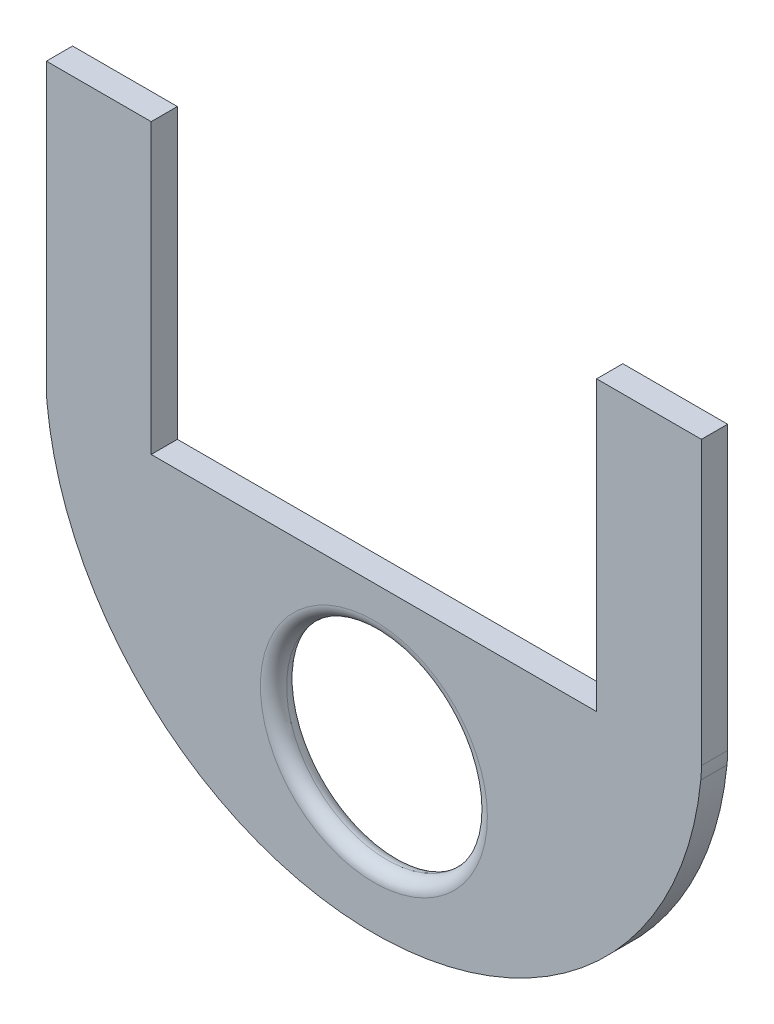
ISO-10303-21;
HEADER;
FILE_DESCRIPTION(('STEP AP214'),'2;1');
FILE_NAME('part.step','',(''),(''),'','','');
FILE_SCHEMA(('AUTOMOTIVE_DESIGN { 1 0 10303 214 1 1 1 1 }'));
ENDSEC;
DATA;
#1=APPLICATION_CONTEXT('core data for automotive mechanical design processes');
#2=APPLICATION_PROTOCOL_DEFINITION('international standard','automotive_design',2000,#1);
#3=PRODUCT_CONTEXT('',#1,'mechanical');
#4=PRODUCT('Part','Part','',(#3));
#5=PRODUCT_RELATED_PRODUCT_CATEGORY('part','',(#4));
#6=PRODUCT_DEFINITION_FORMATION('','',#4);
#7=PRODUCT_DEFINITION_CONTEXT('part definition',#1,'design');
#8=PRODUCT_DEFINITION('design','',#6,#7);
#9=PRODUCT_DEFINITION_SHAPE('','',#8);
#10=(LENGTH_UNIT() NAMED_UNIT(*) SI_UNIT(.MILLI.,.METRE.));
#11=(NAMED_UNIT(*) PLANE_ANGLE_UNIT() SI_UNIT($,.RADIAN.));
#12=(NAMED_UNIT(*) SI_UNIT($,.STERADIAN.) SOLID_ANGLE_UNIT());
#13=UNCERTAINTY_MEASURE_WITH_UNIT(LENGTH_MEASURE(1.E-05),#10,'distance_accuracy_value','');
#14=(GEOMETRIC_REPRESENTATION_CONTEXT(3) GLOBAL_UNCERTAINTY_ASSIGNED_CONTEXT((#13)) GLOBAL_UNIT_ASSIGNED_CONTEXT((#10,
#11,#12)) REPRESENTATION_CONTEXT('',''));
#15=CARTESIAN_POINT('',(0.,0.,0.));
#16=DIRECTION('',(0.,0.,1.));
#17=DIRECTION('',(1.,0.,0.));
#18=AXIS2_PLACEMENT_3D('',#15,#16,#17);
#19=CARTESIAN_POINT('',(17.,1.91395973670146,2.));
#20=DIRECTION('',(0.,0.,1.));
#21=DIRECTION('',(1.,0.,0.));
#22=AXIS2_PLACEMENT_3D('',#19,#20,#21);
#23=PLANE('',#22);
#24=CARTESIAN_POINT('',(17.,-11.1358980691562,2.));
#25=DIRECTION('',(0.,0.,1.));
#26=DIRECTION('',(1.,0.,0.));
#27=AXIS2_PLACEMENT_3D('',#24,#25,#26);
#28=CIRCLE('',#27,8.66384885996612);
#29=CARTESIAN_POINT('',(25.6638488599661,-11.1358980691562,2.));
#30=VERTEX_POINT('',#29);
#31=EDGE_CURVE('E11',#30,#30,#28,.F.);
#32=ORIENTED_EDGE('',*,*,#31,.T.);
#33=EDGE_LOOP('',(#32));
#34=FACE_BOUND('',#33,.T.);
#35=CARTESIAN_POINT('',(17.,1.91395973670146,2.));
#36=DIRECTION('',(0.,0.,1.));
#37=DIRECTION('',(1.,0.,0.));
#38=AXIS2_PLACEMENT_3D('',#35,#36,#37);
#39=CIRCLE('',#38,25.0731577962114);
#40=CARTESIAN_POINT('',(-7.95146485082924,-0.553355336722987,2.));
#41=VERTEX_POINT('',#40);
#42=CARTESIAN_POINT('',(41.9514648508292,-0.553355336723017,2.));
#43=VERTEX_POINT('',#42);
#44=EDGE_CURVE('E218',#41,#43,#39,.T.);
#45=ORIENTED_EDGE('',*,*,#44,.T.);
#46=CARTESIAN_POINT('',(32.,0.430691065999061,2.));
#47=DIRECTION('',(0.,0.,1.));
#48=DIRECTION('',(1.,0.,0.));
#49=AXIS2_PLACEMENT_3D('',#46,#47,#48);
#50=CIRCLE('',#49,10.);
#51=CARTESIAN_POINT('',(42.,0.430691065999061,2.));
#52=VERTEX_POINT('',#51);
#53=EDGE_CURVE('E156',#43,#52,#50,.T.);
#54=ORIENTED_EDGE('',*,*,#53,.T.);
#55=DIRECTION('',(0.,1.,0.));
#56=VECTOR('',#55,1.);
#57=CARTESIAN_POINT('',(42.,22.,2.));
#58=LINE('',#57,#56);
#59=CARTESIAN_POINT('',(42.,22.,2.));
#60=VERTEX_POINT('',#59);
#61=EDGE_CURVE('E221',#52,#60,#58,.T.);
#62=ORIENTED_EDGE('',*,*,#61,.T.);
#63=DIRECTION('',(-1.,0.,0.));
#64=VECTOR('',#63,1.);
#65=CARTESIAN_POINT('',(34.,22.,2.));
#66=LINE('',#65,#64);
#67=CARTESIAN_POINT('',(34.,22.,2.));
#68=VERTEX_POINT('',#67);
#69=EDGE_CURVE('E223',#60,#68,#66,.T.);
#70=ORIENTED_EDGE('',*,*,#69,.T.);
#71=DIRECTION('',(0.,-1.,0.));
#72=VECTOR('',#71,1.);
#73=CARTESIAN_POINT('',(34.,0.,2.));
#74=LINE('',#73,#72);
#75=CARTESIAN_POINT('',(34.,0.,2.));
#76=VERTEX_POINT('',#75);
#77=EDGE_CURVE('E228',#68,#76,#74,.T.);
#78=ORIENTED_EDGE('',*,*,#77,.T.);
#79=DIRECTION('',(-1.,0.,0.));
#80=VECTOR('',#79,1.);
#81=CARTESIAN_POINT('',(0.,0.,2.));
#82=LINE('',#81,#80);
#83=CARTESIAN_POINT('',(0.,0.,2.));
#84=VERTEX_POINT('',#83);
#85=EDGE_CURVE('E129',#76,#84,#82,.T.);
#86=ORIENTED_EDGE('',*,*,#85,.T.);
#87=DIRECTION('',(0.,1.,0.));
#88=VECTOR('',#87,1.);
#89=CARTESIAN_POINT('',(0.,0.,2.));
#90=LINE('',#89,#88);
#91=CARTESIAN_POINT('',(0.,22.,2.));
#92=VERTEX_POINT('',#91);
#93=EDGE_CURVE('E125',#84,#92,#90,.T.);
#94=ORIENTED_EDGE('',*,*,#93,.T.);
#95=DIRECTION('',(-1.,0.,0.));
#96=VECTOR('',#95,1.);
#97=CARTESIAN_POINT('',(0.,22.,2.));
#98=LINE('',#97,#96);
#99=CARTESIAN_POINT('',(-8.,22.,2.));
#100=VERTEX_POINT('',#99);
#101=EDGE_CURVE('E115',#92,#100,#98,.T.);
#102=ORIENTED_EDGE('',*,*,#101,.T.);
#103=DIRECTION('',(0.,-1.,0.));
#104=VECTOR('',#103,1.);
#105=CARTESIAN_POINT('',(-8.,22.,2.));
#106=LINE('',#105,#104);
#107=CARTESIAN_POINT('',(-8.,0.430691065999078,2.));
#108=VERTEX_POINT('',#107);
#109=EDGE_CURVE('E124',#100,#108,#106,.T.);
#110=ORIENTED_EDGE('',*,*,#109,.T.);
#111=CARTESIAN_POINT('',(2.,0.430691065999079,2.));
#112=DIRECTION('',(0.,0.,1.));
#113=DIRECTION('',(1.,0.,0.));
#114=AXIS2_PLACEMENT_3D('',#111,#112,#113);
#115=CIRCLE('',#114,10.);
#116=EDGE_CURVE('E154',#108,#41,#115,.T.);
#117=ORIENTED_EDGE('',*,*,#116,.T.);
#118=EDGE_LOOP('',(#45,#54,#62,#70,#78,#86,#94,#102,#110,#117));
#119=FACE_BOUND('',#118,.T.);
#120=ADVANCED_FACE('F33',(#34,#119),#23,.T.);
#121=CARTESIAN_POINT('',(17.,1.91395973670146,0.));
#122=DIRECTION('',(0.,0.,1.));
#123=DIRECTION('',(1.,0.,0.));
#124=AXIS2_PLACEMENT_3D('',#121,#122,#123);
#125=PLANE('',#124);
#126=CARTESIAN_POINT('',(17.,-11.1358980691562,0.));
#127=DIRECTION('',(0.,0.,1.));
#128=DIRECTION('',(1.,0.,0.));
#129=AXIS2_PLACEMENT_3D('',#126,#127,#128);
#130=CIRCLE('',#129,8.66384885996612);
#131=CARTESIAN_POINT('',(25.6638488599661,-11.1358980691562,0.));
#132=VERTEX_POINT('',#131);
#133=EDGE_CURVE('E42',#132,#132,#130,.T.);
#134=ORIENTED_EDGE('',*,*,#133,.T.);
#135=EDGE_LOOP('',(#134));
#136=FACE_BOUND('',#135,.T.);
#137=DIRECTION('',(0.,1.,0.));
#138=VECTOR('',#137,1.);
#139=CARTESIAN_POINT('',(42.,22.,0.));
#140=LINE('',#139,#138);
#141=CARTESIAN_POINT('',(42.,0.430691065999061,0.));
#142=VERTEX_POINT('',#141);
#143=CARTESIAN_POINT('',(42.,22.,0.));
#144=VERTEX_POINT('',#143);
#145=EDGE_CURVE('E239',#142,#144,#140,.T.);
#146=ORIENTED_EDGE('',*,*,#145,.F.);
#147=CARTESIAN_POINT('',(32.,0.430691065999061,0.));
#148=DIRECTION('',(0.,0.,1.));
#149=DIRECTION('',(1.,0.,0.));
#150=AXIS2_PLACEMENT_3D('',#147,#148,#149);
#151=CIRCLE('',#150,10.);
#152=CARTESIAN_POINT('',(41.9514648508292,-0.553355336723017,0.));
#153=VERTEX_POINT('',#152);
#154=EDGE_CURVE('E148',#142,#153,#151,.F.);
#155=ORIENTED_EDGE('',*,*,#154,.T.);
#156=CARTESIAN_POINT('',(17.,1.91395973670146,0.));
#157=DIRECTION('',(0.,0.,1.));
#158=DIRECTION('',(1.,0.,0.));
#159=AXIS2_PLACEMENT_3D('',#156,#157,#158);
#160=CIRCLE('',#159,25.0731577962114);
#161=CARTESIAN_POINT('',(-7.95146485082924,-0.553355336722987,0.));
#162=VERTEX_POINT('',#161);
#163=EDGE_CURVE('E237',#162,#153,#160,.T.);
#164=ORIENTED_EDGE('',*,*,#163,.F.);
#165=CARTESIAN_POINT('',(2.,0.430691065999079,0.));
#166=DIRECTION('',(0.,0.,1.));
#167=DIRECTION('',(1.,0.,0.));
#168=AXIS2_PLACEMENT_3D('',#165,#166,#167);
#169=CIRCLE('',#168,10.);
#170=CARTESIAN_POINT('',(-8.,0.430691065999078,0.));
#171=VERTEX_POINT('',#170);
#172=EDGE_CURVE('E141',#162,#171,#169,.F.);
#173=ORIENTED_EDGE('',*,*,#172,.T.);
#174=DIRECTION('',(0.,-1.,0.));
#175=VECTOR('',#174,1.);
#176=CARTESIAN_POINT('',(-8.,22.,0.));
#177=LINE('',#176,#175);
#178=CARTESIAN_POINT('',(-8.,22.,0.));
#179=VERTEX_POINT('',#178);
#180=EDGE_CURVE('E235',#179,#171,#177,.T.);
#181=ORIENTED_EDGE('',*,*,#180,.F.);
#182=DIRECTION('',(-1.,0.,0.));
#183=VECTOR('',#182,1.);
#184=CARTESIAN_POINT('',(0.,22.,0.));
#185=LINE('',#184,#183);
#186=CARTESIAN_POINT('',(0.,22.,0.));
#187=VERTEX_POINT('',#186);
#188=EDGE_CURVE('E233',#187,#179,#185,.T.);
#189=ORIENTED_EDGE('',*,*,#188,.F.);
#190=DIRECTION('',(0.,1.,0.));
#191=VECTOR('',#190,1.);
#192=CARTESIAN_POINT('',(0.,0.,0.));
#193=LINE('',#192,#191);
#194=CARTESIAN_POINT('',(0.,0.,0.));
#195=VERTEX_POINT('',#194);
#196=EDGE_CURVE('E137',#195,#187,#193,.T.);
#197=ORIENTED_EDGE('',*,*,#196,.F.);
#198=DIRECTION('',(-1.,0.,0.));
#199=VECTOR('',#198,1.);
#200=CARTESIAN_POINT('',(0.,0.,0.));
#201=LINE('',#200,#199);
#202=CARTESIAN_POINT('',(34.,0.,0.));
#203=VERTEX_POINT('',#202);
#204=EDGE_CURVE('E133',#203,#195,#201,.T.);
#205=ORIENTED_EDGE('',*,*,#204,.F.);
#206=DIRECTION('',(0.,-1.,0.));
#207=VECTOR('',#206,1.);
#208=CARTESIAN_POINT('',(34.,0.,0.));
#209=LINE('',#208,#207);
#210=CARTESIAN_POINT('',(34.,22.,0.));
#211=VERTEX_POINT('',#210);
#212=EDGE_CURVE('E243',#211,#203,#209,.T.);
#213=ORIENTED_EDGE('',*,*,#212,.F.);
#214=DIRECTION('',(-1.,0.,0.));
#215=VECTOR('',#214,1.);
#216=CARTESIAN_POINT('',(34.,22.,0.));
#217=LINE('',#216,#215);
#218=EDGE_CURVE('E241',#144,#211,#217,.T.);
#219=ORIENTED_EDGE('',*,*,#218,.F.);
#220=EDGE_LOOP('',(#146,#155,#164,#173,#181,#189,#197,#205,#213,#219));
#221=FACE_BOUND('',#220,.T.);
#222=ADVANCED_FACE('F162',(#136,#221),#125,.F.);
#223=CARTESIAN_POINT('',(0.,0.,2.));
#224=DIRECTION('',(-1.,0.,0.));
#225=DIRECTION('',(0.,0.,1.));
#226=AXIS2_PLACEMENT_3D('',#223,#224,#225);
#227=PLANE('',#226);
#228=ORIENTED_EDGE('',*,*,#196,.T.);
#229=DIRECTION('',(0.,0.,-1.));
#230=VECTOR('',#229,1.);
#231=CARTESIAN_POINT('',(0.,22.,2.));
#232=LINE('',#231,#230);
#233=EDGE_CURVE('E119',#92,#187,#232,.T.);
#234=ORIENTED_EDGE('',*,*,#233,.F.);
#235=ORIENTED_EDGE('',*,*,#93,.F.);
#236=DIRECTION('',(0.,0.,-1.));
#237=VECTOR('',#236,1.);
#238=CARTESIAN_POINT('',(0.,0.,2.));
#239=LINE('',#238,#237);
#240=EDGE_CURVE('E231',#84,#195,#239,.T.);
#241=ORIENTED_EDGE('',*,*,#240,.T.);
#242=EDGE_LOOP('',(#228,#234,#235,#241));
#243=FACE_BOUND('',#242,.T.);
#244=ADVANCED_FACE('F135',(#243),#227,.F.);
#245=CARTESIAN_POINT('',(0.,22.,2.));
#246=DIRECTION('',(0.,-1.,0.));
#247=DIRECTION('',(0.,0.,-1.));
#248=AXIS2_PLACEMENT_3D('',#245,#246,#247);
#249=PLANE('',#248);
#250=ORIENTED_EDGE('',*,*,#188,.T.);
#251=DIRECTION('',(0.,0.,-1.));
#252=VECTOR('',#251,1.);
#253=CARTESIAN_POINT('',(-8.,22.,2.));
#254=LINE('',#253,#252);
#255=EDGE_CURVE('E122',#100,#179,#254,.T.);
#256=ORIENTED_EDGE('',*,*,#255,.F.);
#257=ORIENTED_EDGE('',*,*,#101,.F.);
#258=ORIENTED_EDGE('',*,*,#233,.T.);
#259=EDGE_LOOP('',(#250,#256,#257,#258));
#260=FACE_BOUND('',#259,.T.);
#261=ADVANCED_FACE('F117',(#260),#249,.F.);
#262=CARTESIAN_POINT('',(-8.,22.,2.));
#263=DIRECTION('',(1.,0.,0.));
#264=DIRECTION('',(0.,0.,-1.));
#265=AXIS2_PLACEMENT_3D('',#262,#263,#264);
#266=PLANE('',#265);
#267=ORIENTED_EDGE('',*,*,#180,.T.);
#268=DIRECTION('',(0.,0.,-1.));
#269=VECTOR('',#268,1.);
#270=CARTESIAN_POINT('',(-8.,0.430691065999078,2.));
#271=LINE('',#270,#269);
#272=EDGE_CURVE('E49',#171,#108,#271,.F.);
#273=ORIENTED_EDGE('',*,*,#272,.T.);
#274=ORIENTED_EDGE('',*,*,#109,.F.);
#275=ORIENTED_EDGE('',*,*,#255,.T.);
#276=EDGE_LOOP('',(#267,#273,#274,#275));
#277=FACE_BOUND('',#276,.T.);
#278=ADVANCED_FACE('F204',(#277),#266,.F.);
#279=CARTESIAN_POINT('',(17.,1.91395973670146,2.));
#280=DIRECTION('',(0.,0.,-1.));
#281=DIRECTION('',(-1.,0.,0.));
#282=AXIS2_PLACEMENT_3D('',#279,#280,#281);
#283=CYLINDRICAL_SURFACE('',#282,25.0731577962114);
#284=ORIENTED_EDGE('',*,*,#163,.T.);
#285=DIRECTION('',(0.,0.,-1.));
#286=VECTOR('',#285,1.);
#287=CARTESIAN_POINT('',(41.9514648508292,-0.553355336723017,2.));
#288=LINE('',#287,#286);
#289=EDGE_CURVE('E57',#153,#43,#288,.F.);
#290=ORIENTED_EDGE('',*,*,#289,.T.);
#291=ORIENTED_EDGE('',*,*,#44,.F.);
#292=DIRECTION('',(0.,0.,-1.));
#293=VECTOR('',#292,1.);
#294=CARTESIAN_POINT('',(-7.95146485082924,-0.553355336722987,2.));
#295=LINE('',#294,#293);
#296=EDGE_CURVE('E150',#41,#162,#295,.T.);
#297=ORIENTED_EDGE('',*,*,#296,.T.);
#298=EDGE_LOOP('',(#284,#290,#291,#297));
#299=FACE_BOUND('',#298,.T.);
#300=ADVANCED_FACE('F200',(#299),#283,.T.);
#301=CARTESIAN_POINT('',(42.,22.,2.));
#302=DIRECTION('',(-1.,0.,0.));
#303=DIRECTION('',(0.,0.,1.));
#304=AXIS2_PLACEMENT_3D('',#301,#302,#303);
#305=PLANE('',#304);
#306=ORIENTED_EDGE('',*,*,#61,.F.);
#307=DIRECTION('',(0.,0.,-1.));
#308=VECTOR('',#307,1.);
#309=CARTESIAN_POINT('',(42.,0.430691065999061,2.));
#310=LINE('',#309,#308);
#311=EDGE_CURVE('E138',#52,#142,#310,.T.);
#312=ORIENTED_EDGE('',*,*,#311,.T.);
#313=ORIENTED_EDGE('',*,*,#145,.T.);
#314=DIRECTION('',(0.,0.,-1.));
#315=VECTOR('',#314,1.);
#316=CARTESIAN_POINT('',(42.,22.,2.));
#317=LINE('',#316,#315);
#318=EDGE_CURVE('E143',#60,#144,#317,.T.);
#319=ORIENTED_EDGE('',*,*,#318,.F.);
#320=EDGE_LOOP('',(#306,#312,#313,#319));
#321=FACE_BOUND('',#320,.T.);
#322=ADVANCED_FACE('F196',(#321),#305,.F.);
#323=CARTESIAN_POINT('',(34.,22.,2.));
#324=DIRECTION('',(0.,-1.,0.));
#325=DIRECTION('',(0.,0.,-1.));
#326=AXIS2_PLACEMENT_3D('',#323,#324,#325);
#327=PLANE('',#326);
#328=ORIENTED_EDGE('',*,*,#218,.T.);
#329=DIRECTION('',(0.,0.,-1.));
#330=VECTOR('',#329,1.);
#331=CARTESIAN_POINT('',(34.,22.,2.));
#332=LINE('',#331,#330);
#333=EDGE_CURVE('E250',#68,#211,#332,.T.);
#334=ORIENTED_EDGE('',*,*,#333,.F.);
#335=ORIENTED_EDGE('',*,*,#69,.F.);
#336=ORIENTED_EDGE('',*,*,#318,.T.);
#337=EDGE_LOOP('',(#328,#334,#335,#336));
#338=FACE_BOUND('',#337,.T.);
#339=ADVANCED_FACE('F192',(#338),#327,.F.);
#340=CARTESIAN_POINT('',(34.,0.,2.));
#341=DIRECTION('',(1.,0.,0.));
#342=DIRECTION('',(0.,0.,-1.));
#343=AXIS2_PLACEMENT_3D('',#340,#341,#342);
#344=PLANE('',#343);
#345=ORIENTED_EDGE('',*,*,#212,.T.);
#346=DIRECTION('',(0.,0.,-1.));
#347=VECTOR('',#346,1.);
#348=CARTESIAN_POINT('',(34.,0.,2.));
#349=LINE('',#348,#347);
#350=EDGE_CURVE('E247',#76,#203,#349,.T.);
#351=ORIENTED_EDGE('',*,*,#350,.F.);
#352=ORIENTED_EDGE('',*,*,#77,.F.);
#353=ORIENTED_EDGE('',*,*,#333,.T.);
#354=EDGE_LOOP('',(#345,#351,#352,#353));
#355=FACE_BOUND('',#354,.T.);
#356=ADVANCED_FACE('F188',(#355),#344,.F.);
#357=CARTESIAN_POINT('',(0.,0.,2.));
#358=DIRECTION('',(0.,-1.,0.));
#359=DIRECTION('',(0.,0.,-1.));
#360=AXIS2_PLACEMENT_3D('',#357,#358,#359);
#361=PLANE('',#360);
#362=ORIENTED_EDGE('',*,*,#204,.T.);
#363=ORIENTED_EDGE('',*,*,#240,.F.);
#364=ORIENTED_EDGE('',*,*,#85,.F.);
#365=ORIENTED_EDGE('',*,*,#350,.T.);
#366=EDGE_LOOP('',(#362,#363,#364,#365));
#367=FACE_BOUND('',#366,.T.);
#368=ADVANCED_FACE('F184',(#367),#361,.F.);
#369=CARTESIAN_POINT('',(32.,0.430691065999061,2.));
#370=DIRECTION('',(0.,0.,-1.));
#371=DIRECTION('',(-1.,0.,0.));
#372=AXIS2_PLACEMENT_3D('',#369,#370,#371);
#373=CYLINDRICAL_SURFACE('',#372,10.);
#374=ORIENTED_EDGE('',*,*,#53,.F.);
#375=ORIENTED_EDGE('',*,*,#289,.F.);
#376=ORIENTED_EDGE('',*,*,#154,.F.);
#377=ORIENTED_EDGE('',*,*,#311,.F.);
#378=EDGE_LOOP('',(#374,#375,#376,#377));
#379=FACE_BOUND('',#378,.T.);
#380=ADVANCED_FACE('F187',(#379),#373,.T.);
#381=CARTESIAN_POINT('',(2.,0.430691065999079,2.));
#382=DIRECTION('',(0.,0.,-1.));
#383=DIRECTION('',(-1.,0.,0.));
#384=AXIS2_PLACEMENT_3D('',#381,#382,#383);
#385=CYLINDRICAL_SURFACE('',#384,10.);
#386=ORIENTED_EDGE('',*,*,#116,.F.);
#387=ORIENTED_EDGE('',*,*,#272,.F.);
#388=ORIENTED_EDGE('',*,*,#172,.F.);
#389=ORIENTED_EDGE('',*,*,#296,.F.);
#390=EDGE_LOOP('',(#386,#387,#388,#389));
#391=FACE_BOUND('',#390,.T.);
#392=ADVANCED_FACE('F171',(#391),#385,.T.);
#393=CARTESIAN_POINT('',(17.,-11.1358980691562,1.));
#394=DIRECTION('',(0.,0.,1.));
#395=DIRECTION('',(1.,0.,0.));
#396=AXIS2_PLACEMENT_3D('',#393,#394,#395);
#397=TOROIDAL_SURFACE('',#396,8.66384885996612,1.);
#398=ORIENTED_EDGE('',*,*,#31,.F.);
#399=EDGE_LOOP('',(#398));
#400=FACE_BOUND('',#399,.T.);
#401=CARTESIAN_POINT('',(17.,-11.1358980691562,1.));
#402=DIRECTION('',(0.,0.,1.));
#403=DIRECTION('',(1.,0.,0.));
#404=AXIS2_PLACEMENT_3D('',#401,#402,#403);
#405=CIRCLE('',#404,7.66384885996612);
#406=CARTESIAN_POINT('',(24.6638488599661,-11.1358980691562,1.));
#407=VERTEX_POINT('',#406);
#408=EDGE_CURVE('E37',#407,#407,#405,.T.);
#409=ORIENTED_EDGE('',*,*,#408,.F.);
#410=EDGE_LOOP('',(#409));
#411=FACE_BOUND('',#410,.T.);
#412=ADVANCED_FACE('F35',(#400,#411),#397,.T.);
#413=CARTESIAN_POINT('',(17.,-11.1358980691562,1.));
#414=DIRECTION('',(0.,0.,1.));
#415=DIRECTION('',(1.,0.,0.));
#416=AXIS2_PLACEMENT_3D('',#413,#414,#415);
#417=TOROIDAL_SURFACE('',#416,8.66384885996612,1.);
#418=ORIENTED_EDGE('',*,*,#408,.T.);
#419=EDGE_LOOP('',(#418));
#420=FACE_BOUND('',#419,.T.);
#421=ORIENTED_EDGE('',*,*,#133,.F.);
#422=EDGE_LOOP('',(#421));
#423=FACE_BOUND('',#422,.T.);
#424=ADVANCED_FACE('F165',(#420,#423),#417,.T.);
#425=CLOSED_SHELL('',(#120,#222,#244,#261,#278,#300,#322,#339,#356,#368,#380,#392,#412,#424));
#426=MANIFOLD_SOLID_BREP('B2',#425);
#427=ADVANCED_BREP_SHAPE_REPRESENTATION('',(#18,#426),#14);
#428=SHAPE_DEFINITION_REPRESENTATION(#9,#427);
ENDSEC;
END-ISO-10303-21;
